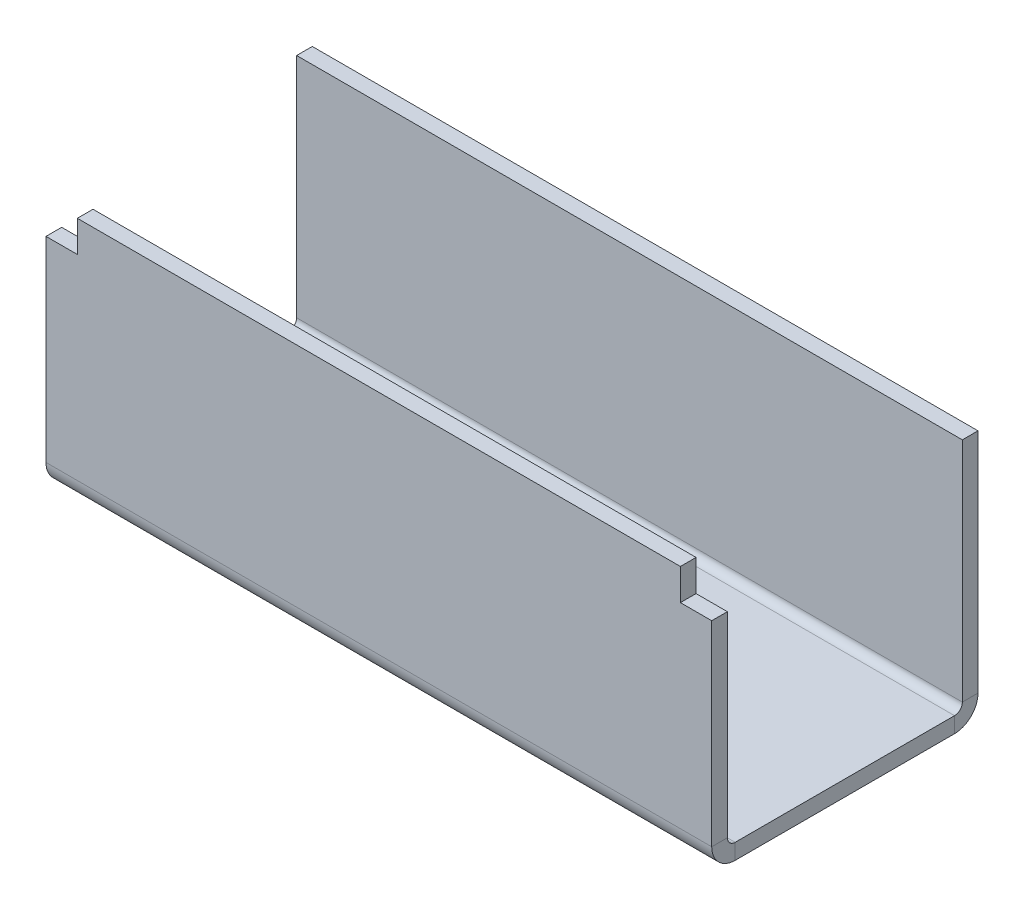
ISO-10303-21;
HEADER;
FILE_DESCRIPTION(('STEP AP214'),'2;1');
FILE_NAME('part.step','',(''),(''),'','','');
FILE_SCHEMA(('AUTOMOTIVE_DESIGN { 1 0 10303 214 1 1 1 1 }'));
ENDSEC;
DATA;
#1=APPLICATION_CONTEXT('core data for automotive mechanical design processes');
#2=APPLICATION_PROTOCOL_DEFINITION('international standard','automotive_design',2000,#1);
#3=PRODUCT_CONTEXT('',#1,'mechanical');
#4=PRODUCT('Part','Part','',(#3));
#5=PRODUCT_RELATED_PRODUCT_CATEGORY('part','',(#4));
#6=PRODUCT_DEFINITION_FORMATION('','',#4);
#7=PRODUCT_DEFINITION_CONTEXT('part definition',#1,'design');
#8=PRODUCT_DEFINITION('design','',#6,#7);
#9=PRODUCT_DEFINITION_SHAPE('','',#8);
#10=(LENGTH_UNIT() NAMED_UNIT(*) SI_UNIT(.MILLI.,.METRE.));
#11=(NAMED_UNIT(*) PLANE_ANGLE_UNIT() SI_UNIT($,.RADIAN.));
#12=(NAMED_UNIT(*) SI_UNIT($,.STERADIAN.) SOLID_ANGLE_UNIT());
#13=UNCERTAINTY_MEASURE_WITH_UNIT(LENGTH_MEASURE(1.E-05),#10,'distance_accuracy_value','');
#14=(GEOMETRIC_REPRESENTATION_CONTEXT(3) GLOBAL_UNCERTAINTY_ASSIGNED_CONTEXT((#13)) GLOBAL_UNIT_ASSIGNED_CONTEXT((#10,
#11,#12)) REPRESENTATION_CONTEXT('',''));
#15=CARTESIAN_POINT('',(0.,0.,0.));
#16=DIRECTION('',(0.,0.,1.));
#17=DIRECTION('',(1.,0.,0.));
#18=AXIS2_PLACEMENT_3D('',#15,#16,#17);
#19=CARTESIAN_POINT('',(-1.116736E-11,-0.149085714286,-0.02));
#20=DIRECTION('',(0.,0.,1.));
#21=DIRECTION('',(0.,-1.,0.));
#22=AXIS2_PLACEMENT_3D('',#19,#20,#21);
#23=PLANE('',#22);
#24=DIRECTION('',(1.,0.,0.));
#25=VECTOR('',#24,1.);
#26=CARTESIAN_POINT('',(-0.425000000011,0.01,-0.02));
#27=LINE('',#26,#25);
#28=CARTESIAN_POINT('',(-0.425000000011,0.01,-0.02));
#29=VERTEX_POINT('',#28);
#30=CARTESIAN_POINT('',(0.424999999989,0.01,-0.02));
#31=VERTEX_POINT('',#30);
#32=EDGE_CURVE('E338',#29,#31,#27,.T.);
#33=ORIENTED_EDGE('',*,*,#32,.F.);
#34=DIRECTION('',(0.,1.,0.));
#35=VECTOR('',#34,1.);
#36=CARTESIAN_POINT('',(-0.425000000011,-0.560000000023,-0.02));
#37=LINE('',#36,#35);
#38=CARTESIAN_POINT('',(-0.425000000011,0.3,-0.02));
#39=VERTEX_POINT('',#38);
#40=EDGE_CURVE('E25',#29,#39,#37,.T.);
#41=ORIENTED_EDGE('',*,*,#40,.T.);
#42=DIRECTION('',(1.,0.,0.));
#43=VECTOR('',#42,1.);
#44=CARTESIAN_POINT('',(-0.425000000011,0.3,-0.02));
#45=LINE('',#44,#43);
#46=CARTESIAN_POINT('',(0.424999999989,0.3,-0.02));
#47=VERTEX_POINT('',#46);
#48=EDGE_CURVE('E11',#39,#47,#45,.T.);
#49=ORIENTED_EDGE('',*,*,#48,.T.);
#50=DIRECTION('',(0.,-1.,0.));
#51=VECTOR('',#50,1.);
#52=CARTESIAN_POINT('',(0.424999999989,0.3,-0.02));
#53=LINE('',#52,#51);
#54=EDGE_CURVE('E342',#47,#31,#53,.T.);
#55=ORIENTED_EDGE('',*,*,#54,.T.);
#56=EDGE_LOOP('',(#33,#41,#49,#55));
#57=FACE_BOUND('',#56,.T.);
#58=ADVANCED_FACE('F17',(#57),#23,.F.);
#59=CARTESIAN_POINT('',(-0.425000000011,0.3,0.));
#60=DIRECTION('',(0.,-1.,0.));
#61=DIRECTION('',(0.,0.,-1.));
#62=AXIS2_PLACEMENT_3D('',#59,#60,#61);
#63=PLANE('',#62);
#64=DIRECTION('',(0.,0.,-1.));
#65=VECTOR('',#64,1.);
#66=CARTESIAN_POINT('',(-0.425000000011,0.3,0.));
#67=LINE('',#66,#65);
#68=CARTESIAN_POINT('',(-0.425000000011,0.3,0.));
#69=VERTEX_POINT('',#68);
#70=EDGE_CURVE('E346',#69,#39,#67,.T.);
#71=ORIENTED_EDGE('',*,*,#70,.F.);
#72=DIRECTION('',(1.,0.,0.));
#73=VECTOR('',#72,1.);
#74=CARTESIAN_POINT('',(-0.425000000011,0.3,0.));
#75=LINE('',#74,#73);
#76=CARTESIAN_POINT('',(0.424999999989,0.3,0.));
#77=VERTEX_POINT('',#76);
#78=EDGE_CURVE('E259',#69,#77,#75,.T.);
#79=ORIENTED_EDGE('',*,*,#78,.T.);
#80=DIRECTION('',(0.,0.,-1.));
#81=VECTOR('',#80,1.);
#82=CARTESIAN_POINT('',(0.424999999989,0.3,0.));
#83=LINE('',#82,#81);
#84=EDGE_CURVE('E344',#77,#47,#83,.T.);
#85=ORIENTED_EDGE('',*,*,#84,.T.);
#86=ORIENTED_EDGE('',*,*,#48,.F.);
#87=EDGE_LOOP('',(#71,#79,#85,#86));
#88=FACE_BOUND('',#87,.T.);
#89=ADVANCED_FACE('F463',(#88),#63,.F.);
#90=CARTESIAN_POINT('',(-0.425000000011,-0.560000000023,0.));
#91=DIRECTION('',(1.,0.,0.));
#92=DIRECTION('',(0.,1.,0.));
#93=AXIS2_PLACEMENT_3D('',#90,#91,#92);
#94=PLANE('',#93);
#95=DIRECTION('',(0.,1.,0.));
#96=VECTOR('',#95,1.);
#97=CARTESIAN_POINT('',(-0.425000000011,-0.560000000023,0.));
#98=LINE('',#97,#96);
#99=CARTESIAN_POINT('',(-0.425000000011,0.01,0.));
#100=VERTEX_POINT('',#99);
#101=EDGE_CURVE('E334',#100,#69,#98,.T.);
#102=ORIENTED_EDGE('',*,*,#101,.T.);
#103=ORIENTED_EDGE('',*,*,#70,.T.);
#104=ORIENTED_EDGE('',*,*,#40,.F.);
#105=DIRECTION('',(0.,0.,-1.));
#106=VECTOR('',#105,1.);
#107=CARTESIAN_POINT('',(-0.425000000011,0.01,0.));
#108=LINE('',#107,#106);
#109=EDGE_CURVE('E326',#100,#29,#108,.T.);
#110=ORIENTED_EDGE('',*,*,#109,.F.);
#111=EDGE_LOOP('',(#102,#103,#104,#110));
#112=FACE_BOUND('',#111,.T.);
#113=ADVANCED_FACE('F467',(#112),#94,.F.);
#114=CARTESIAN_POINT('',(0.424999999989,0.3,0.));
#115=DIRECTION('',(-1.,0.,0.));
#116=DIRECTION('',(0.,0.,1.));
#117=AXIS2_PLACEMENT_3D('',#114,#115,#116);
#118=PLANE('',#117);
#119=DIRECTION('',(0.,-1.,0.));
#120=VECTOR('',#119,1.);
#121=CARTESIAN_POINT('',(0.424999999989,0.3,0.));
#122=LINE('',#121,#120);
#123=CARTESIAN_POINT('',(0.424999999989,0.01,0.));
#124=VERTEX_POINT('',#123);
#125=EDGE_CURVE('E256',#77,#124,#122,.T.);
#126=ORIENTED_EDGE('',*,*,#125,.T.);
#127=DIRECTION('',(0.,0.,-1.));
#128=VECTOR('',#127,1.);
#129=CARTESIAN_POINT('',(0.424999999989,0.01,0.));
#130=LINE('',#129,#128);
#131=EDGE_CURVE('E216',#124,#31,#130,.T.);
#132=ORIENTED_EDGE('',*,*,#131,.T.);
#133=ORIENTED_EDGE('',*,*,#54,.F.);
#134=ORIENTED_EDGE('',*,*,#84,.F.);
#135=EDGE_LOOP('',(#126,#132,#133,#134));
#136=FACE_BOUND('',#135,.T.);
#137=ADVANCED_FACE('F479',(#136),#118,.F.);
#138=CARTESIAN_POINT('',(-0.425000000011,0.01,0.01));
#139=DIRECTION('',(1.,0.,0.));
#140=DIRECTION('',(0.,0.,1.));
#141=AXIS2_PLACEMENT_3D('',#138,#139,#140);
#142=CYLINDRICAL_SURFACE('',#141,0.03);
#143=DIRECTION('',(-1.,0.,0.));
#144=VECTOR('',#143,1.);
#145=CARTESIAN_POINT('',(-0.425000000011,-0.02,0.01));
#146=LINE('',#145,#144);
#147=CARTESIAN_POINT('',(0.424999999989,-0.02,0.01));
#148=VERTEX_POINT('',#147);
#149=CARTESIAN_POINT('',(-0.425000000011,-0.02,0.01));
#150=VERTEX_POINT('',#149);
#151=EDGE_CURVE('E217',#148,#150,#146,.T.);
#152=ORIENTED_EDGE('',*,*,#151,.T.);
#153=CARTESIAN_POINT('',(-0.425000000011,0.00999999999999739,0.00999999999999739));
#154=DIRECTION('',(1.,0.,0.));
#155=DIRECTION('',(0.,0.,-1.));
#156=AXIS2_PLACEMENT_3D('',#153,#154,#155);
#157=CIRCLE('',#156,0.0299999999999974);
#158=EDGE_CURVE('E183',#150,#29,#157,.T.);
#159=ORIENTED_EDGE('',*,*,#158,.T.);
#160=ORIENTED_EDGE('',*,*,#32,.T.);
#161=CARTESIAN_POINT('',(0.424999999989,0.00999999999999742,0.00999999999999739));
#162=DIRECTION('',(-1.,0.,0.));
#163=DIRECTION('',(0.,-1.,0.));
#164=AXIS2_PLACEMENT_3D('',#161,#162,#163);
#165=CIRCLE('',#164,0.0299999999999974);
#166=EDGE_CURVE('E214',#31,#148,#165,.T.);
#167=ORIENTED_EDGE('',*,*,#166,.T.);
#168=EDGE_LOOP('',(#152,#159,#160,#167));
#169=FACE_BOUND('',#168,.T.);
#170=ADVANCED_FACE('F470',(#169),#142,.T.);
#171=CARTESIAN_POINT('',(-1.116736E-11,-0.149085714286,0.));
#172=DIRECTION('',(0.,0.,1.));
#173=DIRECTION('',(0.,-1.,0.));
#174=AXIS2_PLACEMENT_3D('',#171,#172,#173);
#175=PLANE('',#174);
#176=DIRECTION('',(1.,0.,0.));
#177=VECTOR('',#176,1.);
#178=CARTESIAN_POINT('',(-0.425000000011,0.01,0.));
#179=LINE('',#178,#177);
#180=EDGE_CURVE('E172',#100,#124,#179,.T.);
#181=ORIENTED_EDGE('',*,*,#180,.T.);
#182=ORIENTED_EDGE('',*,*,#125,.F.);
#183=ORIENTED_EDGE('',*,*,#78,.F.);
#184=ORIENTED_EDGE('',*,*,#101,.F.);
#185=EDGE_LOOP('',(#181,#182,#183,#184));
#186=FACE_BOUND('',#185,.T.);
#187=ADVANCED_FACE('F476',(#186),#175,.T.);
#188=CARTESIAN_POINT('',(-0.425000000011,0.00293014320761232,0.0029301432076107));
#189=DIRECTION('',(-1.,0.,0.));
#190=DIRECTION('',(0.,0.,1.));
#191=AXIS2_PLACEMENT_3D('',#188,#189,#190);
#192=PLANE('',#191);
#193=CARTESIAN_POINT('',(-0.425000000011,0.,0.01));
#194=CARTESIAN_POINT('',(-0.425000000011,0.,0.00859053317719946));
#195=CARTESIAN_POINT('',(-0.425000000011,0.000302362106223044,0.0071817573528489));
#196=CARTESIAN_POINT('',(-0.425000000011,0.000880761014787982,0.00589640641259526));
#197=CARTESIAN_POINT('',(-0.425000000011,0.00145718878442667,0.00461543584933527));
#198=CARTESIAN_POINT('',(-0.425000000011,0.0023071448290487,0.00345835388561256));
#199=CARTESIAN_POINT('',(-0.425000000011,0.00335711778388607,0.00252523472857928));
#200=CARTESIAN_POINT('',(-0.425000000011,0.00441021677479708,0.00158933743889748));
#201=CARTESIAN_POINT('',(-0.425000000011,0.00566343641291246,0.000879740273416439));
#202=CARTESIAN_POINT('',(-0.425000000011,0.00700775820697442,0.000458171608540057));
#203=CARTESIAN_POINT('',(-0.425000000011,0.00797428014966812,0.00015507798411554));
#204=CARTESIAN_POINT('',(-0.425000000011,0.00898708768721184,0.));
#205=CARTESIAN_POINT('',(-0.425000000011,0.01,0.));
#206=(BOUNDED_CURVE() B_SPLINE_CURVE(3,(#193,#194,#195,#196,#197,#198,#199,#200,#201,#202,#203,
#204,#205),.UNSPECIFIED.,.F.,.F.) B_SPLINE_CURVE_WITH_KNOTS((4,3,3,3,4),(0.,0.0053838691453262,
0.0107493904793252,0.0161308863326362,0.02),
.UNSPECIFIED.) CURVE() GEOMETRIC_REPRESENTATION_ITEM() RATIONAL_B_SPLINE_CURVE((1.,1.,1.,1.,1.,
1.,1.,1.,1.,1.,1.,1.,1.)) REPRESENTATION_ITEM(''));
#207=CARTESIAN_POINT('',(-0.425000000011,0.,0.01));
#208=VERTEX_POINT('',#207);
#209=EDGE_CURVE('E164',#208,#100,#206,.T.);
#210=ORIENTED_EDGE('',*,*,#209,.T.);
#211=ORIENTED_EDGE('',*,*,#109,.T.);
#212=ORIENTED_EDGE('',*,*,#158,.F.);
#213=DIRECTION('',(0.,-1.,0.));
#214=VECTOR('',#213,1.);
#215=CARTESIAN_POINT('',(-0.425000000011,0.,0.01));
#216=LINE('',#215,#214);
#217=EDGE_CURVE('E179',#208,#150,#216,.T.);
#218=ORIENTED_EDGE('',*,*,#217,.F.);
#219=EDGE_LOOP('',(#210,#211,#212,#218));
#220=FACE_BOUND('',#219,.T.);
#221=ADVANCED_FACE('F181',(#220),#192,.T.);
#222=CARTESIAN_POINT('',(0.424999999989,0.0029301432076107,0.00293014320761232));
#223=DIRECTION('',(1.,0.,0.));
#224=DIRECTION('',(0.,1.,0.));
#225=AXIS2_PLACEMENT_3D('',#222,#223,#224);
#226=PLANE('',#225);
#227=CARTESIAN_POINT('',(0.424999999989,0.01,0.));
#228=CARTESIAN_POINT('',(0.424999999989,0.00859053317721571,0.));
#229=CARTESIAN_POINT('',(0.424999999989,0.00718175735288133,0.000302362106215972));
#230=CARTESIAN_POINT('',(0.424999999989,0.00589640641263964,0.000880761014768012));
#231=CARTESIAN_POINT('',(0.424999999989,0.00461543584935873,0.00145718878440862));
#232=CARTESIAN_POINT('',(0.424999999989,0.00345835388561739,0.00230714482904098));
#233=CARTESIAN_POINT('',(0.424999999989,0.0025252347285721,0.00335711778389415));
#234=CARTESIAN_POINT('',(0.424999999989,0.00158933743889387,0.00441021677480344));
#235=CARTESIAN_POINT('',(0.424999999989,0.000879740273415373,0.00566343641291589));
#236=CARTESIAN_POINT('',(0.424999999989,0.000458171608540076,0.00700775820697436));
#237=CARTESIAN_POINT('',(0.424999999989,0.000155077984115554,0.00797428014966805));
#238=CARTESIAN_POINT('',(0.424999999989,0.,0.0089870876872118));
#239=CARTESIAN_POINT('',(0.424999999989,0.,0.01));
#240=(BOUNDED_CURVE() B_SPLINE_CURVE(3,(#227,#228,#229,#230,#231,#232,#233,#234,#235,#236,#237,
#238,#239),.UNSPECIFIED.,.F.,.F.) B_SPLINE_CURVE_WITH_KNOTS((4,3,3,3,4),(0.,0.00538386914526424,
0.010749390479339,0.0161308863326361,0.02),
.UNSPECIFIED.) CURVE() GEOMETRIC_REPRESENTATION_ITEM() RATIONAL_B_SPLINE_CURVE((1.,1.,1.,1.,1.,
1.,1.,1.,1.,1.,1.,1.,1.)) REPRESENTATION_ITEM(''));
#241=CARTESIAN_POINT('',(0.424999999989,0.,0.01));
#242=VERTEX_POINT('',#241);
#243=EDGE_CURVE('E269',#124,#242,#240,.T.);
#244=ORIENTED_EDGE('',*,*,#243,.T.);
#245=DIRECTION('',(0.,-1.,0.));
#246=VECTOR('',#245,1.);
#247=CARTESIAN_POINT('',(0.424999999989,0.,0.01));
#248=LINE('',#247,#246);
#249=EDGE_CURVE('E188',#242,#148,#248,.T.);
#250=ORIENTED_EDGE('',*,*,#249,.T.);
#251=ORIENTED_EDGE('',*,*,#166,.F.);
#252=ORIENTED_EDGE('',*,*,#131,.F.);
#253=EDGE_LOOP('',(#244,#250,#251,#252));
#254=FACE_BOUND('',#253,.T.);
#255=ADVANCED_FACE('F482',(#254),#226,.T.);
#256=CARTESIAN_POINT('',(-1.116736E-11,-0.02,0.149085714286));
#257=DIRECTION('',(0.,1.,0.));
#258=DIRECTION('',(0.,0.,-1.));
#259=AXIS2_PLACEMENT_3D('',#256,#257,#258);
#260=PLANE('',#259);
#261=DIRECTION('',(1.,0.,0.));
#262=VECTOR('',#261,1.);
#263=CARTESIAN_POINT('',(0.424999999989,-0.02,0.29));
#264=LINE('',#263,#262);
#265=CARTESIAN_POINT('',(-0.425000000011,-0.02,0.29));
#266=VERTEX_POINT('',#265);
#267=CARTESIAN_POINT('',(0.424999999989,-0.02,0.29));
#268=VERTEX_POINT('',#267);
#269=EDGE_CURVE('E242',#266,#268,#264,.T.);
#270=ORIENTED_EDGE('',*,*,#269,.F.);
#271=DIRECTION('',(0.,0.,-1.));
#272=VECTOR('',#271,1.);
#273=CARTESIAN_POINT('',(-0.425000000011,-0.02,0.560000000023));
#274=LINE('',#273,#272);
#275=EDGE_CURVE('E187',#266,#150,#274,.T.);
#276=ORIENTED_EDGE('',*,*,#275,.T.);
#277=ORIENTED_EDGE('',*,*,#151,.F.);
#278=DIRECTION('',(0.,0.,1.));
#279=VECTOR('',#278,1.);
#280=CARTESIAN_POINT('',(0.424999999989,-0.02,-0.3));
#281=LINE('',#280,#279);
#282=EDGE_CURVE('E246',#148,#268,#281,.T.);
#283=ORIENTED_EDGE('',*,*,#282,.T.);
#284=EDGE_LOOP('',(#270,#276,#277,#283));
#285=FACE_BOUND('',#284,.T.);
#286=ADVANCED_FACE('F484',(#285),#260,.F.);
#287=CARTESIAN_POINT('',(-1.116736E-11,-0.150914285714,0.32));
#288=DIRECTION('',(0.,0.,-1.));
#289=DIRECTION('',(-1.,0.,0.));
#290=AXIS2_PLACEMENT_3D('',#287,#288,#289);
#291=PLANE('',#290);
#292=DIRECTION('',(-1.,0.,0.));
#293=VECTOR('',#292,1.);
#294=CARTESIAN_POINT('',(0.385000000011,0.3,0.32));
#295=LINE('',#294,#293);
#296=CARTESIAN_POINT('',(0.385000000011,0.3,0.32));
#297=VERTEX_POINT('',#296);
#298=CARTESIAN_POINT('',(-0.385000000011,0.3,0.32));
#299=VERTEX_POINT('',#298);
#300=EDGE_CURVE('E301',#297,#299,#295,.T.);
#301=ORIENTED_EDGE('',*,*,#300,.T.);
#302=DIRECTION('',(0.,-1.,0.));
#303=VECTOR('',#302,1.);
#304=CARTESIAN_POINT('',(-0.385000000011,0.3,0.32));
#305=LINE('',#304,#303);
#306=CARTESIAN_POINT('',(-0.385000000011,0.260000000023,0.32));
#307=VERTEX_POINT('',#306);
#308=EDGE_CURVE('E309',#299,#307,#305,.T.);
#309=ORIENTED_EDGE('',*,*,#308,.T.);
#310=DIRECTION('',(-1.,0.,0.));
#311=VECTOR('',#310,1.);
#312=CARTESIAN_POINT('',(-0.385000000011,0.260000000023,0.32));
#313=LINE('',#312,#311);
#314=CARTESIAN_POINT('',(-0.425000000011,0.260000000023,0.32));
#315=VERTEX_POINT('',#314);
#316=EDGE_CURVE('E313',#307,#315,#313,.T.);
#317=ORIENTED_EDGE('',*,*,#316,.T.);
#318=DIRECTION('',(0.,-1.,0.));
#319=VECTOR('',#318,1.);
#320=CARTESIAN_POINT('',(-0.425000000011,0.260000000023,0.32));
#321=LINE('',#320,#319);
#322=CARTESIAN_POINT('',(-0.425000000011,0.01,0.32));
#323=VERTEX_POINT('',#322);
#324=EDGE_CURVE('E176',#315,#323,#321,.T.);
#325=ORIENTED_EDGE('',*,*,#324,.T.);
#326=DIRECTION('',(-1.,0.,0.));
#327=VECTOR('',#326,1.);
#328=CARTESIAN_POINT('',(0.424999999989,0.01,0.32));
#329=LINE('',#328,#327);
#330=CARTESIAN_POINT('',(0.424999999989,0.01,0.32));
#331=VERTEX_POINT('',#330);
#332=EDGE_CURVE('E247',#331,#323,#329,.T.);
#333=ORIENTED_EDGE('',*,*,#332,.F.);
#334=DIRECTION('',(0.,1.,0.));
#335=VECTOR('',#334,1.);
#336=CARTESIAN_POINT('',(0.424999999989,-0.6,0.32));
#337=LINE('',#336,#335);
#338=CARTESIAN_POINT('',(0.424999999989,0.260000000023,0.32));
#339=VERTEX_POINT('',#338);
#340=EDGE_CURVE('E255',#331,#339,#337,.T.);
#341=ORIENTED_EDGE('',*,*,#340,.T.);
#342=DIRECTION('',(1.,0.,0.));
#343=VECTOR('',#342,1.);
#344=CARTESIAN_POINT('',(0.385000000011,0.260000000023,0.32));
#345=LINE('',#344,#343);
#346=CARTESIAN_POINT('',(0.385000000011,0.260000000023,0.32));
#347=VERTEX_POINT('',#346);
#348=EDGE_CURVE('E317',#347,#339,#345,.T.);
#349=ORIENTED_EDGE('',*,*,#348,.F.);
#350=DIRECTION('',(0.,-1.,0.));
#351=VECTOR('',#350,1.);
#352=CARTESIAN_POINT('',(0.385000000011,0.3,0.32));
#353=LINE('',#352,#351);
#354=EDGE_CURVE('E320',#297,#347,#353,.T.);
#355=ORIENTED_EDGE('',*,*,#354,.F.);
#356=EDGE_LOOP('',(#301,#309,#317,#325,#333,#341,#349,#355));
#357=FACE_BOUND('',#356,.T.);
#358=ADVANCED_FACE('F382',(#357),#291,.F.);
#359=CARTESIAN_POINT('',(0.385000000011,0.3,0.3));
#360=DIRECTION('',(1.,0.,0.));
#361=DIRECTION('',(0.,1.,0.));
#362=AXIS2_PLACEMENT_3D('',#359,#360,#361);
#363=PLANE('',#362);
#364=DIRECTION('',(0.,0.,1.));
#365=VECTOR('',#364,1.);
#366=CARTESIAN_POINT('',(0.385000000011,0.3,0.3));
#367=LINE('',#366,#365);
#368=CARTESIAN_POINT('',(0.385000000011,0.3,0.3));
#369=VERTEX_POINT('',#368);
#370=EDGE_CURVE('E293',#369,#297,#367,.T.);
#371=ORIENTED_EDGE('',*,*,#370,.T.);
#372=ORIENTED_EDGE('',*,*,#354,.T.);
#373=DIRECTION('',(0.,0.,1.));
#374=VECTOR('',#373,1.);
#375=CARTESIAN_POINT('',(0.385000000011,0.260000000023,0.3));
#376=LINE('',#375,#374);
#377=CARTESIAN_POINT('',(0.385000000011,0.260000000023,0.3));
#378=VERTEX_POINT('',#377);
#379=EDGE_CURVE('E316',#378,#347,#376,.T.);
#380=ORIENTED_EDGE('',*,*,#379,.F.);
#381=DIRECTION('',(0.,-1.,0.));
#382=VECTOR('',#381,1.);
#383=CARTESIAN_POINT('',(0.385000000011,0.3,0.3));
#384=LINE('',#383,#382);
#385=EDGE_CURVE('E221',#369,#378,#384,.T.);
#386=ORIENTED_EDGE('',*,*,#385,.F.);
#387=EDGE_LOOP('',(#371,#372,#380,#386));
#388=FACE_BOUND('',#387,.T.);
#389=ADVANCED_FACE('F398',(#388),#363,.T.);
#390=CARTESIAN_POINT('',(0.385000000011,0.260000000023,0.3));
#391=DIRECTION('',(0.,1.,0.));
#392=DIRECTION('',(1.,0.,0.));
#393=AXIS2_PLACEMENT_3D('',#390,#391,#392);
#394=PLANE('',#393);
#395=ORIENTED_EDGE('',*,*,#379,.T.);
#396=ORIENTED_EDGE('',*,*,#348,.T.);
#397=DIRECTION('',(0.,0.,1.));
#398=VECTOR('',#397,1.);
#399=CARTESIAN_POINT('',(0.424999999989,0.260000000023,0.3));
#400=LINE('',#399,#398);
#401=CARTESIAN_POINT('',(0.424999999989,0.260000000023,0.3));
#402=VERTEX_POINT('',#401);
#403=EDGE_CURVE('E251',#402,#339,#400,.T.);
#404=ORIENTED_EDGE('',*,*,#403,.F.);
#405=DIRECTION('',(1.,0.,0.));
#406=VECTOR('',#405,1.);
#407=CARTESIAN_POINT('',(0.385000000011,0.260000000023,0.3));
#408=LINE('',#407,#406);
#409=EDGE_CURVE('E225',#378,#402,#408,.T.);
#410=ORIENTED_EDGE('',*,*,#409,.F.);
#411=EDGE_LOOP('',(#395,#396,#404,#410));
#412=FACE_BOUND('',#411,.T.);
#413=ADVANCED_FACE('F393',(#412),#394,.T.);
#414=CARTESIAN_POINT('',(-0.385000000011,0.260000000023,0.3));
#415=DIRECTION('',(0.,-1.,0.));
#416=DIRECTION('',(0.,0.,-1.));
#417=AXIS2_PLACEMENT_3D('',#414,#415,#416);
#418=PLANE('',#417);
#419=DIRECTION('',(0.,0.,1.));
#420=VECTOR('',#419,1.);
#421=CARTESIAN_POINT('',(-0.385000000011,0.260000000023,0.3));
#422=LINE('',#421,#420);
#423=CARTESIAN_POINT('',(-0.385000000011,0.260000000023,0.3));
#424=VERTEX_POINT('',#423);
#425=EDGE_CURVE('E305',#424,#307,#422,.T.);
#426=ORIENTED_EDGE('',*,*,#425,.F.);
#427=DIRECTION('',(-1.,0.,0.));
#428=VECTOR('',#427,1.);
#429=CARTESIAN_POINT('',(-0.385000000011,0.260000000023,0.3));
#430=LINE('',#429,#428);
#431=CARTESIAN_POINT('',(-0.425000000011,0.260000000023,0.3));
#432=VERTEX_POINT('',#431);
#433=EDGE_CURVE('E237',#424,#432,#430,.T.);
#434=ORIENTED_EDGE('',*,*,#433,.T.);
#435=DIRECTION('',(0.,0.,1.));
#436=VECTOR('',#435,1.);
#437=CARTESIAN_POINT('',(-0.425000000011,0.260000000023,0.3));
#438=LINE('',#437,#436);
#439=EDGE_CURVE('E289',#432,#315,#438,.T.);
#440=ORIENTED_EDGE('',*,*,#439,.T.);
#441=ORIENTED_EDGE('',*,*,#316,.F.);
#442=EDGE_LOOP('',(#426,#434,#440,#441));
#443=FACE_BOUND('',#442,.T.);
#444=ADVANCED_FACE('F406',(#443),#418,.F.);
#445=CARTESIAN_POINT('',(-0.385000000011,0.3,0.3));
#446=DIRECTION('',(1.,0.,0.));
#447=DIRECTION('',(0.,1.,0.));
#448=AXIS2_PLACEMENT_3D('',#445,#446,#447);
#449=PLANE('',#448);
#450=DIRECTION('',(0.,0.,1.));
#451=VECTOR('',#450,1.);
#452=CARTESIAN_POINT('',(-0.385000000011,0.3,0.3));
#453=LINE('',#452,#451);
#454=CARTESIAN_POINT('',(-0.385000000011,0.3,0.3));
#455=VERTEX_POINT('',#454);
#456=EDGE_CURVE('E297',#455,#299,#453,.T.);
#457=ORIENTED_EDGE('',*,*,#456,.F.);
#458=DIRECTION('',(0.,-1.,0.));
#459=VECTOR('',#458,1.);
#460=CARTESIAN_POINT('',(-0.385000000011,0.3,0.3));
#461=LINE('',#460,#459);
#462=EDGE_CURVE('E241',#455,#424,#461,.T.);
#463=ORIENTED_EDGE('',*,*,#462,.T.);
#464=ORIENTED_EDGE('',*,*,#425,.T.);
#465=ORIENTED_EDGE('',*,*,#308,.F.);
#466=EDGE_LOOP('',(#457,#463,#464,#465));
#467=FACE_BOUND('',#466,.T.);
#468=ADVANCED_FACE('F404',(#467),#449,.F.);
#469=CARTESIAN_POINT('',(0.385000000011,0.3,0.3));
#470=DIRECTION('',(0.,-1.,0.));
#471=DIRECTION('',(0.,0.,-1.));
#472=AXIS2_PLACEMENT_3D('',#469,#470,#471);
#473=PLANE('',#472);
#474=ORIENTED_EDGE('',*,*,#370,.F.);
#475=DIRECTION('',(-1.,0.,0.));
#476=VECTOR('',#475,1.);
#477=CARTESIAN_POINT('',(0.385000000011,0.3,0.3));
#478=LINE('',#477,#476);
#479=EDGE_CURVE('E226',#369,#455,#478,.T.);
#480=ORIENTED_EDGE('',*,*,#479,.T.);
#481=ORIENTED_EDGE('',*,*,#456,.T.);
#482=ORIENTED_EDGE('',*,*,#300,.F.);
#483=EDGE_LOOP('',(#474,#480,#481,#482));
#484=FACE_BOUND('',#483,.T.);
#485=ADVANCED_FACE('F396',(#484),#473,.F.);
#486=CARTESIAN_POINT('',(-0.425000000011,0.260000000023,0.3));
#487=DIRECTION('',(1.,0.,0.));
#488=DIRECTION('',(0.,1.,0.));
#489=AXIS2_PLACEMENT_3D('',#486,#487,#488);
#490=PLANE('',#489);
#491=DIRECTION('',(0.,-1.,0.));
#492=VECTOR('',#491,1.);
#493=CARTESIAN_POINT('',(-0.425000000011,0.260000000023,0.3));
#494=LINE('',#493,#492);
#495=CARTESIAN_POINT('',(-0.425000000011,0.01,0.3));
#496=VERTEX_POINT('',#495);
#497=EDGE_CURVE('E234',#432,#496,#494,.T.);
#498=ORIENTED_EDGE('',*,*,#497,.T.);
#499=DIRECTION('',(0.,0.,1.));
#500=VECTOR('',#499,1.);
#501=CARTESIAN_POINT('',(-0.425000000011,0.01,0.3));
#502=LINE('',#501,#500);
#503=EDGE_CURVE('E212',#496,#323,#502,.T.);
#504=ORIENTED_EDGE('',*,*,#503,.T.);
#505=ORIENTED_EDGE('',*,*,#324,.F.);
#506=ORIENTED_EDGE('',*,*,#439,.F.);
#507=EDGE_LOOP('',(#498,#504,#505,#506));
#508=FACE_BOUND('',#507,.T.);
#509=ADVANCED_FACE('F367',(#508),#490,.F.);
#510=CARTESIAN_POINT('',(-0.425000000011,0.01,0.01));
#511=DIRECTION('',(1.,0.,0.));
#512=DIRECTION('',(0.,0.,1.));
#513=AXIS2_PLACEMENT_3D('',#510,#511,#512);
#514=CYLINDRICAL_SURFACE('',#513,0.01);
#515=DIRECTION('',(-1.,0.,0.));
#516=VECTOR('',#515,1.);
#517=CARTESIAN_POINT('',(-0.425000000011,0.,0.01));
#518=LINE('',#517,#516);
#519=EDGE_CURVE('E169',#242,#208,#518,.T.);
#520=ORIENTED_EDGE('',*,*,#519,.F.);
#521=ORIENTED_EDGE('',*,*,#243,.F.);
#522=ORIENTED_EDGE('',*,*,#180,.F.);
#523=ORIENTED_EDGE('',*,*,#209,.F.);
#524=EDGE_LOOP('',(#520,#521,#522,#523));
#525=FACE_BOUND('',#524,.T.);
#526=ADVANCED_FACE('F166',(#525),#514,.F.);
#527=CARTESIAN_POINT('',(-0.425000000011,0.,0.560000000023));
#528=DIRECTION('',(1.,0.,0.));
#529=DIRECTION('',(0.,1.,0.));
#530=AXIS2_PLACEMENT_3D('',#527,#528,#529);
#531=PLANE('',#530);
#532=DIRECTION('',(0.,0.,-1.));
#533=VECTOR('',#532,1.);
#534=CARTESIAN_POINT('',(-0.425000000011,0.,0.560000000023));
#535=LINE('',#534,#533);
#536=CARTESIAN_POINT('',(-0.425000000011,0.,0.29));
#537=VERTEX_POINT('',#536);
#538=EDGE_CURVE('E191',#537,#208,#535,.T.);
#539=ORIENTED_EDGE('',*,*,#538,.T.);
#540=ORIENTED_EDGE('',*,*,#217,.T.);
#541=ORIENTED_EDGE('',*,*,#275,.F.);
#542=DIRECTION('',(0.,-1.,0.));
#543=VECTOR('',#542,1.);
#544=CARTESIAN_POINT('',(-0.425000000011,0.,0.29));
#545=LINE('',#544,#543);
#546=EDGE_CURVE('E194',#537,#266,#545,.T.);
#547=ORIENTED_EDGE('',*,*,#546,.F.);
#548=EDGE_LOOP('',(#539,#540,#541,#547));
#549=FACE_BOUND('',#548,.T.);
#550=ADVANCED_FACE('F192',(#549),#531,.F.);
#551=CARTESIAN_POINT('',(0.424999999989,0.,-0.3));
#552=DIRECTION('',(-1.,0.,0.));
#553=DIRECTION('',(0.,0.,1.));
#554=AXIS2_PLACEMENT_3D('',#551,#552,#553);
#555=PLANE('',#554);
#556=DIRECTION('',(0.,0.,1.));
#557=VECTOR('',#556,1.);
#558=CARTESIAN_POINT('',(0.424999999989,0.,-0.3));
#559=LINE('',#558,#557);
#560=CARTESIAN_POINT('',(0.424999999989,0.,0.29));
#561=VERTEX_POINT('',#560);
#562=EDGE_CURVE('E201',#242,#561,#559,.T.);
#563=ORIENTED_EDGE('',*,*,#562,.T.);
#564=DIRECTION('',(0.,-1.,0.));
#565=VECTOR('',#564,1.);
#566=CARTESIAN_POINT('',(0.424999999989,0.,0.29));
#567=LINE('',#566,#565);
#568=EDGE_CURVE('E208',#561,#268,#567,.T.);
#569=ORIENTED_EDGE('',*,*,#568,.T.);
#570=ORIENTED_EDGE('',*,*,#282,.F.);
#571=ORIENTED_EDGE('',*,*,#249,.F.);
#572=EDGE_LOOP('',(#563,#569,#570,#571));
#573=FACE_BOUND('',#572,.T.);
#574=ADVANCED_FACE('F444',(#573),#555,.F.);
#575=CARTESIAN_POINT('',(0.424999999989,0.01,0.29));
#576=DIRECTION('',(-1.,0.,0.));
#577=DIRECTION('',(0.,0.,-1.));
#578=AXIS2_PLACEMENT_3D('',#575,#576,#577);
#579=CYLINDRICAL_SURFACE('',#578,0.03);
#580=CARTESIAN_POINT('',(0.424999999989,0.01,0.29));
#581=DIRECTION('',(-1.,0.,0.));
#582=DIRECTION('',(0.,-1.,0.));
#583=AXIS2_PLACEMENT_3D('',#580,#581,#582);
#584=CIRCLE('',#583,0.03);
#585=EDGE_CURVE('E378',#268,#331,#584,.T.);
#586=ORIENTED_EDGE('',*,*,#585,.T.);
#587=ORIENTED_EDGE('',*,*,#332,.T.);
#588=CARTESIAN_POINT('',(-0.425000000011,0.01,0.29));
#589=DIRECTION('',(1.,0.,0.));
#590=DIRECTION('',(0.,0.,1.));
#591=AXIS2_PLACEMENT_3D('',#588,#589,#590);
#592=CIRCLE('',#591,0.03);
#593=EDGE_CURVE('E220',#323,#266,#592,.T.);
#594=ORIENTED_EDGE('',*,*,#593,.T.);
#595=ORIENTED_EDGE('',*,*,#269,.T.);
#596=EDGE_LOOP('',(#586,#587,#594,#595));
#597=FACE_BOUND('',#596,.T.);
#598=ADVANCED_FACE('F374',(#597),#579,.T.);
#599=CARTESIAN_POINT('',(0.424999999989,-0.6,0.3));
#600=DIRECTION('',(-1.,0.,0.));
#601=DIRECTION('',(0.,0.,1.));
#602=AXIS2_PLACEMENT_3D('',#599,#600,#601);
#603=PLANE('',#602);
#604=DIRECTION('',(0.,1.,0.));
#605=VECTOR('',#604,1.);
#606=CARTESIAN_POINT('',(0.424999999989,-0.6,0.3));
#607=LINE('',#606,#605);
#608=CARTESIAN_POINT('',(0.424999999989,0.01,0.3));
#609=VERTEX_POINT('',#608);
#610=EDGE_CURVE('E230',#609,#402,#607,.T.);
#611=ORIENTED_EDGE('',*,*,#610,.T.);
#612=ORIENTED_EDGE('',*,*,#403,.T.);
#613=ORIENTED_EDGE('',*,*,#340,.F.);
#614=DIRECTION('',(0.,0.,1.));
#615=VECTOR('',#614,1.);
#616=CARTESIAN_POINT('',(0.424999999989,0.01,0.3));
#617=LINE('',#616,#615);
#618=EDGE_CURVE('E387',#609,#331,#617,.T.);
#619=ORIENTED_EDGE('',*,*,#618,.F.);
#620=EDGE_LOOP('',(#611,#612,#613,#619));
#621=FACE_BOUND('',#620,.T.);
#622=ADVANCED_FACE('F386',(#621),#603,.F.);
#623=CARTESIAN_POINT('',(-1.116736E-11,-0.150914285714,0.3));
#624=DIRECTION('',(0.,0.,-1.));
#625=DIRECTION('',(-1.,0.,0.));
#626=AXIS2_PLACEMENT_3D('',#623,#624,#625);
#627=PLANE('',#626);
#628=ORIENTED_EDGE('',*,*,#479,.F.);
#629=ORIENTED_EDGE('',*,*,#385,.T.);
#630=ORIENTED_EDGE('',*,*,#409,.T.);
#631=ORIENTED_EDGE('',*,*,#610,.F.);
#632=DIRECTION('',(-1.,0.,0.));
#633=VECTOR('',#632,1.);
#634=CARTESIAN_POINT('',(0.424999999989,0.01,0.3));
#635=LINE('',#634,#633);
#636=EDGE_CURVE('E407',#609,#496,#635,.T.);
#637=ORIENTED_EDGE('',*,*,#636,.T.);
#638=ORIENTED_EDGE('',*,*,#497,.F.);
#639=ORIENTED_EDGE('',*,*,#433,.F.);
#640=ORIENTED_EDGE('',*,*,#462,.F.);
#641=EDGE_LOOP('',(#628,#629,#630,#631,#637,#638,#639,#640));
#642=FACE_BOUND('',#641,.T.);
#643=ADVANCED_FACE('F401',(#642),#627,.T.);
#644=CARTESIAN_POINT('',(-0.425000000011,0.00292893257189505,0.297071067428016));
#645=DIRECTION('',(-1.,0.,0.));
#646=DIRECTION('',(0.,0.,1.));
#647=AXIS2_PLACEMENT_3D('',#644,#645,#646);
#648=PLANE('',#647);
#649=CARTESIAN_POINT('',(-0.425000000011,0.01,0.29));
#650=DIRECTION('',(1.,0.,0.));
#651=DIRECTION('',(0.,0.,1.));
#652=AXIS2_PLACEMENT_3D('',#649,#650,#651);
#653=CIRCLE('',#652,0.01);
#654=EDGE_CURVE('E413',#496,#537,#653,.T.);
#655=ORIENTED_EDGE('',*,*,#654,.T.);
#656=ORIENTED_EDGE('',*,*,#546,.T.);
#657=ORIENTED_EDGE('',*,*,#593,.F.);
#658=ORIENTED_EDGE('',*,*,#503,.F.);
#659=EDGE_LOOP('',(#655,#656,#657,#658));
#660=FACE_BOUND('',#659,.T.);
#661=ADVANCED_FACE('F371',(#660),#648,.T.);
#662=CARTESIAN_POINT('',(-1.116736E-11,0.,0.149085714286));
#663=DIRECTION('',(0.,1.,0.));
#664=DIRECTION('',(0.,0.,-1.));
#665=AXIS2_PLACEMENT_3D('',#662,#663,#664);
#666=PLANE('',#665);
#667=DIRECTION('',(1.,0.,0.));
#668=VECTOR('',#667,1.);
#669=CARTESIAN_POINT('',(0.424999999989,0.,0.29));
#670=LINE('',#669,#668);
#671=EDGE_CURVE('E417',#537,#561,#670,.T.);
#672=ORIENTED_EDGE('',*,*,#671,.T.);
#673=ORIENTED_EDGE('',*,*,#562,.F.);
#674=ORIENTED_EDGE('',*,*,#519,.T.);
#675=ORIENTED_EDGE('',*,*,#538,.F.);
#676=EDGE_LOOP('',(#672,#673,#674,#675));
#677=FACE_BOUND('',#676,.T.);
#678=ADVANCED_FACE('F200',(#677),#666,.T.);
#679=CARTESIAN_POINT('',(0.424999999989,0.00292893257189514,0.297071067428016));
#680=DIRECTION('',(1.,0.,0.));
#681=DIRECTION('',(0.,1.,0.));
#682=AXIS2_PLACEMENT_3D('',#679,#680,#681);
#683=PLANE('',#682);
#684=CARTESIAN_POINT('',(0.424999999989,0.01,0.29));
#685=DIRECTION('',(-1.,0.,0.));
#686=DIRECTION('',(0.,-1.,0.));
#687=AXIS2_PLACEMENT_3D('',#684,#685,#686);
#688=CIRCLE('',#687,0.01);
#689=EDGE_CURVE('E423',#561,#609,#688,.T.);
#690=ORIENTED_EDGE('',*,*,#689,.T.);
#691=ORIENTED_EDGE('',*,*,#618,.T.);
#692=ORIENTED_EDGE('',*,*,#585,.F.);
#693=ORIENTED_EDGE('',*,*,#568,.F.);
#694=EDGE_LOOP('',(#690,#691,#692,#693));
#695=FACE_BOUND('',#694,.T.);
#696=ADVANCED_FACE('F447',(#695),#683,.T.);
#697=CARTESIAN_POINT('',(0.424999999989,0.01,0.29));
#698=DIRECTION('',(-1.,0.,0.));
#699=DIRECTION('',(0.,0.,-1.));
#700=AXIS2_PLACEMENT_3D('',#697,#698,#699);
#701=CYLINDRICAL_SURFACE('',#700,0.01);
#702=ORIENTED_EDGE('',*,*,#689,.F.);
#703=ORIENTED_EDGE('',*,*,#671,.F.);
#704=ORIENTED_EDGE('',*,*,#654,.F.);
#705=ORIENTED_EDGE('',*,*,#636,.F.);
#706=EDGE_LOOP('',(#702,#703,#704,#705));
#707=FACE_BOUND('',#706,.T.);
#708=ADVANCED_FACE('F416',(#707),#701,.F.);
#709=CLOSED_SHELL('',(#58,#89,#113,#137,#170,#187,#221,#255,#286,#358,#389,#413,#444,#468,#485,
#509,#526,#550,#574,#598,#622,#643,#661,#678,#696,#708));
#710=MANIFOLD_SOLID_BREP('B1',#709);
#711=ADVANCED_BREP_SHAPE_REPRESENTATION('',(#18,#710),#14);
#712=SHAPE_DEFINITION_REPRESENTATION(#9,#711);
ENDSEC;
END-ISO-10303-21;
